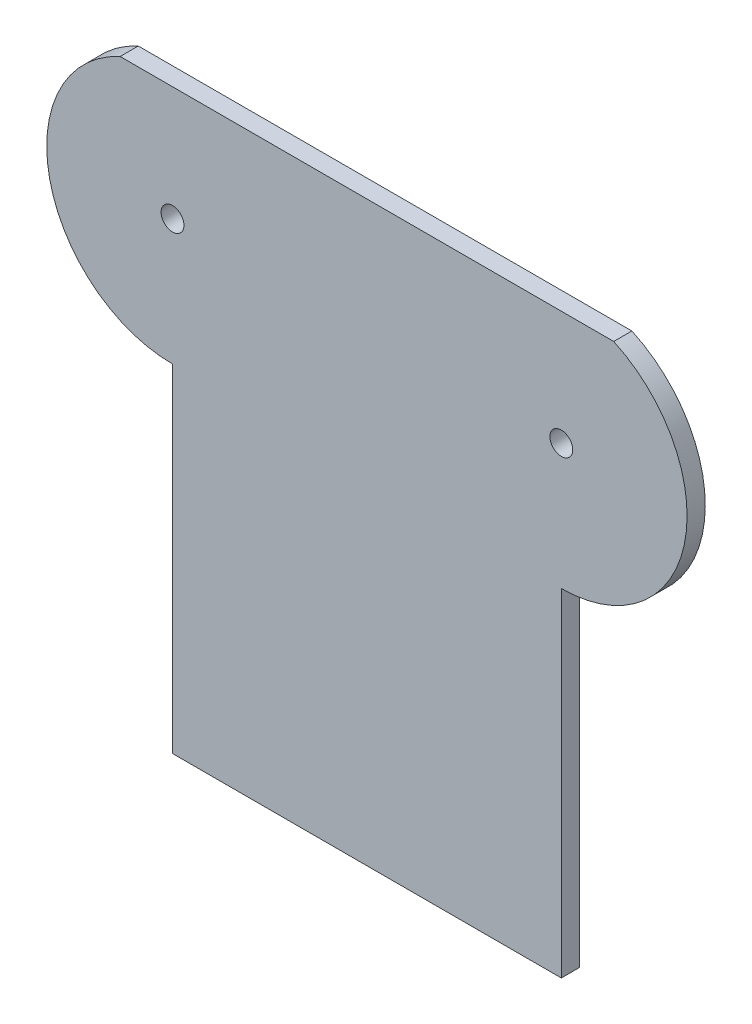
ISO-10303-21;
HEADER;
FILE_DESCRIPTION(('STEP AP214'),'2;1');
FILE_NAME('part.step','',(''),(''),'','','');
FILE_SCHEMA(('AUTOMOTIVE_DESIGN { 1 0 10303 214 1 1 1 1 }'));
ENDSEC;
DATA;
#1=APPLICATION_CONTEXT('core data for automotive mechanical design processes');
#2=APPLICATION_PROTOCOL_DEFINITION('international standard','automotive_design',2000,#1);
#3=PRODUCT_CONTEXT('',#1,'mechanical');
#4=PRODUCT('Part','Part','',(#3));
#5=PRODUCT_RELATED_PRODUCT_CATEGORY('part','',(#4));
#6=PRODUCT_DEFINITION_FORMATION('','',#4);
#7=PRODUCT_DEFINITION_CONTEXT('part definition',#1,'design');
#8=PRODUCT_DEFINITION('design','',#6,#7);
#9=PRODUCT_DEFINITION_SHAPE('','',#8);
#10=(LENGTH_UNIT() NAMED_UNIT(*) SI_UNIT(.MILLI.,.METRE.));
#11=(NAMED_UNIT(*) PLANE_ANGLE_UNIT() SI_UNIT($,.RADIAN.));
#12=(NAMED_UNIT(*) SI_UNIT($,.STERADIAN.) SOLID_ANGLE_UNIT());
#13=UNCERTAINTY_MEASURE_WITH_UNIT(LENGTH_MEASURE(1.E-05),#10,'distance_accuracy_value','');
#14=(GEOMETRIC_REPRESENTATION_CONTEXT(3) GLOBAL_UNCERTAINTY_ASSIGNED_CONTEXT((#13)) GLOBAL_UNIT_ASSIGNED_CONTEXT((#10,
#11,#12)) REPRESENTATION_CONTEXT('',''));
#15=CARTESIAN_POINT('',(0.,0.,0.));
#16=DIRECTION('',(0.,0.,1.));
#17=DIRECTION('',(1.,0.,0.));
#18=AXIS2_PLACEMENT_3D('',#15,#16,#17);
#19=CARTESIAN_POINT('',(56.,50.,3.175));
#20=DIRECTION('',(0.,0.,1.));
#21=DIRECTION('',(1.,0.,0.));
#22=AXIS2_PLACEMENT_3D('',#19,#20,#21);
#23=PLANE('',#22);
#24=CARTESIAN_POINT('',(56.,50.,3.175));
#25=DIRECTION('',(0.,0.,1.));
#26=DIRECTION('',(1.,0.,0.));
#27=AXIS2_PLACEMENT_3D('',#24,#25,#26);
#28=CIRCLE('',#27,2.);
#29=CARTESIAN_POINT('',(58.,50.,3.175));
#30=VERTEX_POINT('',#29);
#31=EDGE_CURVE('E130',#30,#30,#28,.T.);
#32=ORIENTED_EDGE('',*,*,#31,.F.);
#33=EDGE_LOOP('',(#32));
#34=FACE_BOUND('',#33,.T.);
#35=CARTESIAN_POINT('',(56.,50.,3.175));
#36=DIRECTION('',(0.,0.,1.));
#37=DIRECTION('',(1.,0.,0.));
#38=AXIS2_PLACEMENT_3D('',#35,#36,#37);
#39=CIRCLE('',#38,22.);
#40=CARTESIAN_POINT('',(46.8348486100883,70.,3.175));
#41=VERTEX_POINT('',#40);
#42=CARTESIAN_POINT('',(56.,28.,3.175));
#43=VERTEX_POINT('',#42);
#44=EDGE_CURVE('E138',#41,#43,#39,.T.);
#45=ORIENTED_EDGE('',*,*,#44,.T.);
#46=DIRECTION('',(0.,-1.,0.));
#47=VECTOR('',#46,1.);
#48=CARTESIAN_POINT('',(56.,28.,3.175));
#49=LINE('',#48,#47);
#50=CARTESIAN_POINT('',(56.,-31.,3.175));
#51=VERTEX_POINT('',#50);
#52=EDGE_CURVE('E96',#43,#51,#49,.T.);
#53=ORIENTED_EDGE('',*,*,#52,.T.);
#54=DIRECTION('',(1.,0.,0.));
#55=VECTOR('',#54,1.);
#56=CARTESIAN_POINT('',(56.,-31.,3.175));
#57=LINE('',#56,#55);
#58=CARTESIAN_POINT('',(124.,-31.,3.175));
#59=VERTEX_POINT('',#58);
#60=EDGE_CURVE('E109',#51,#59,#57,.T.);
#61=ORIENTED_EDGE('',*,*,#60,.T.);
#62=DIRECTION('',(0.,1.,0.));
#63=VECTOR('',#62,1.);
#64=CARTESIAN_POINT('',(124.,-31.,3.175));
#65=LINE('',#64,#63);
#66=CARTESIAN_POINT('',(124.,27.9999999999999,3.175));
#67=VERTEX_POINT('',#66);
#68=EDGE_CURVE('E103',#59,#67,#65,.T.);
#69=ORIENTED_EDGE('',*,*,#68,.T.);
#70=CARTESIAN_POINT('',(124.,49.9999999999999,3.175));
#71=DIRECTION('',(0.,0.,1.));
#72=DIRECTION('',(-1.,0.,0.));
#73=AXIS2_PLACEMENT_3D('',#70,#71,#72);
#74=CIRCLE('',#73,22.);
#75=CARTESIAN_POINT('',(133.165151389912,70.,3.175));
#76=VERTEX_POINT('',#75);
#77=EDGE_CURVE('E107',#67,#76,#74,.T.);
#78=ORIENTED_EDGE('',*,*,#77,.T.);
#79=DIRECTION('',(-1.,0.,0.));
#80=VECTOR('',#79,1.);
#81=CARTESIAN_POINT('',(46.8348486100883,70.,3.175));
#82=LINE('',#81,#80);
#83=EDGE_CURVE('E59',#76,#41,#82,.T.);
#84=ORIENTED_EDGE('',*,*,#83,.T.);
#85=EDGE_LOOP('',(#45,#53,#61,#69,#78,#84));
#86=FACE_BOUND('',#85,.T.);
#87=CARTESIAN_POINT('',(124.,49.9999999999999,3.175));
#88=DIRECTION('',(0.,0.,1.));
#89=DIRECTION('',(1.,0.,0.));
#90=AXIS2_PLACEMENT_3D('',#87,#88,#89);
#91=CIRCLE('',#90,1.99999999999997);
#92=CARTESIAN_POINT('',(126.,49.9999999999999,3.175));
#93=VERTEX_POINT('',#92);
#94=EDGE_CURVE('E180',#93,#93,#91,.T.);
#95=ORIENTED_EDGE('',*,*,#94,.F.);
#96=EDGE_LOOP('',(#95));
#97=FACE_BOUND('',#96,.T.);
#98=ADVANCED_FACE('F42',(#34,#86,#97),#23,.T.);
#99=CARTESIAN_POINT('',(56.,50.,0.));
#100=DIRECTION('',(0.,0.,1.));
#101=DIRECTION('',(1.,0.,0.));
#102=AXIS2_PLACEMENT_3D('',#99,#100,#101);
#103=PLANE('',#102);
#104=CARTESIAN_POINT('',(56.,50.,0.));
#105=DIRECTION('',(0.,0.,1.));
#106=DIRECTION('',(1.,0.,0.));
#107=AXIS2_PLACEMENT_3D('',#104,#105,#106);
#108=CIRCLE('',#107,22.);
#109=CARTESIAN_POINT('',(46.8348486100883,70.,0.));
#110=VERTEX_POINT('',#109);
#111=CARTESIAN_POINT('',(56.,28.,0.));
#112=VERTEX_POINT('',#111);
#113=EDGE_CURVE('E126',#110,#112,#108,.T.);
#114=ORIENTED_EDGE('',*,*,#113,.F.);
#115=DIRECTION('',(-1.,0.,0.));
#116=VECTOR('',#115,1.);
#117=CARTESIAN_POINT('',(46.8348486100883,70.,0.));
#118=LINE('',#117,#116);
#119=CARTESIAN_POINT('',(133.165151389912,70.,0.));
#120=VERTEX_POINT('',#119);
#121=EDGE_CURVE('E88',#120,#110,#118,.T.);
#122=ORIENTED_EDGE('',*,*,#121,.F.);
#123=CARTESIAN_POINT('',(124.,49.9999999999999,0.));
#124=DIRECTION('',(0.,0.,1.));
#125=DIRECTION('',(-1.,0.,0.));
#126=AXIS2_PLACEMENT_3D('',#123,#124,#125);
#127=CIRCLE('',#126,22.);
#128=CARTESIAN_POINT('',(124.,27.9999999999999,0.));
#129=VERTEX_POINT('',#128);
#130=EDGE_CURVE('E82',#129,#120,#127,.T.);
#131=ORIENTED_EDGE('',*,*,#130,.F.);
#132=DIRECTION('',(0.,1.,0.));
#133=VECTOR('',#132,1.);
#134=CARTESIAN_POINT('',(124.,28.,0.));
#135=LINE('',#134,#133);
#136=CARTESIAN_POINT('',(124.,-31.,0.));
#137=VERTEX_POINT('',#136);
#138=EDGE_CURVE('E116',#137,#129,#135,.T.);
#139=ORIENTED_EDGE('',*,*,#138,.F.);
#140=DIRECTION('',(1.,0.,0.));
#141=VECTOR('',#140,1.);
#142=CARTESIAN_POINT('',(56.,-31.,0.));
#143=LINE('',#142,#141);
#144=CARTESIAN_POINT('',(56.,-31.,0.));
#145=VERTEX_POINT('',#144);
#146=EDGE_CURVE('E132',#145,#137,#143,.T.);
#147=ORIENTED_EDGE('',*,*,#146,.F.);
#148=DIRECTION('',(0.,-1.,0.));
#149=VECTOR('',#148,1.);
#150=CARTESIAN_POINT('',(56.,0.,0.));
#151=LINE('',#150,#149);
#152=EDGE_CURVE('E129',#112,#145,#151,.T.);
#153=ORIENTED_EDGE('',*,*,#152,.F.);
#154=EDGE_LOOP('',(#114,#122,#131,#139,#147,#153));
#155=FACE_BOUND('',#154,.T.);
#156=CARTESIAN_POINT('',(56.,50.,0.));
#157=DIRECTION('',(0.,0.,1.));
#158=DIRECTION('',(1.,0.,0.));
#159=AXIS2_PLACEMENT_3D('',#156,#157,#158);
#160=CIRCLE('',#159,2.);
#161=CARTESIAN_POINT('',(58.,50.,0.));
#162=VERTEX_POINT('',#161);
#163=EDGE_CURVE('E186',#162,#162,#160,.T.);
#164=ORIENTED_EDGE('',*,*,#163,.T.);
#165=EDGE_LOOP('',(#164));
#166=FACE_BOUND('',#165,.T.);
#167=CARTESIAN_POINT('',(124.,49.9999999999999,0.));
#168=DIRECTION('',(0.,0.,1.));
#169=DIRECTION('',(1.,0.,0.));
#170=AXIS2_PLACEMENT_3D('',#167,#168,#169);
#171=CIRCLE('',#170,1.99999999999997);
#172=CARTESIAN_POINT('',(126.,49.9999999999999,0.));
#173=VERTEX_POINT('',#172);
#174=EDGE_CURVE('E183',#173,#173,#171,.T.);
#175=ORIENTED_EDGE('',*,*,#174,.T.);
#176=EDGE_LOOP('',(#175));
#177=FACE_BOUND('',#176,.T.);
#178=ADVANCED_FACE('F147',(#155,#166,#177),#103,.F.);
#179=CARTESIAN_POINT('',(56.,50.,3.175));
#180=DIRECTION('',(0.,0.,-1.));
#181=DIRECTION('',(-1.,0.,0.));
#182=AXIS2_PLACEMENT_3D('',#179,#180,#181);
#183=CYLINDRICAL_SURFACE('',#182,22.);
#184=ORIENTED_EDGE('',*,*,#113,.T.);
#185=DIRECTION('',(0.,0.,-1.));
#186=VECTOR('',#185,1.);
#187=CARTESIAN_POINT('',(56.,28.,3.175));
#188=LINE('',#187,#186);
#189=EDGE_CURVE('E11',#43,#112,#188,.T.);
#190=ORIENTED_EDGE('',*,*,#189,.F.);
#191=ORIENTED_EDGE('',*,*,#44,.F.);
#192=DIRECTION('',(0.,0.,-1.));
#193=VECTOR('',#192,1.);
#194=CARTESIAN_POINT('',(46.8348486100883,70.,3.175));
#195=LINE('',#194,#193);
#196=EDGE_CURVE('E122',#41,#110,#195,.T.);
#197=ORIENTED_EDGE('',*,*,#196,.T.);
#198=EDGE_LOOP('',(#184,#190,#191,#197));
#199=FACE_BOUND('',#198,.T.);
#200=ADVANCED_FACE('F44',(#199),#183,.T.);
#201=CARTESIAN_POINT('',(56.,0.,3.175));
#202=DIRECTION('',(1.,0.,0.));
#203=DIRECTION('',(0.,1.,0.));
#204=AXIS2_PLACEMENT_3D('',#201,#202,#203);
#205=PLANE('',#204);
#206=ORIENTED_EDGE('',*,*,#152,.T.);
#207=DIRECTION('',(0.,0.,-1.));
#208=VECTOR('',#207,1.);
#209=CARTESIAN_POINT('',(56.,-31.,3.175));
#210=LINE('',#209,#208);
#211=EDGE_CURVE('E51',#51,#145,#210,.T.);
#212=ORIENTED_EDGE('',*,*,#211,.F.);
#213=ORIENTED_EDGE('',*,*,#52,.F.);
#214=ORIENTED_EDGE('',*,*,#189,.T.);
#215=EDGE_LOOP('',(#206,#212,#213,#214));
#216=FACE_BOUND('',#215,.T.);
#217=ADVANCED_FACE('F229',(#216),#205,.F.);
#218=CARTESIAN_POINT('',(56.,-31.,3.175));
#219=DIRECTION('',(0.,1.,0.));
#220=DIRECTION('',(-1.,0.,0.));
#221=AXIS2_PLACEMENT_3D('',#218,#219,#220);
#222=PLANE('',#221);
#223=ORIENTED_EDGE('',*,*,#146,.T.);
#224=DIRECTION('',(0.,0.,-1.));
#225=VECTOR('',#224,1.);
#226=CARTESIAN_POINT('',(124.,-31.,3.175));
#227=LINE('',#226,#225);
#228=EDGE_CURVE('E117',#59,#137,#227,.T.);
#229=ORIENTED_EDGE('',*,*,#228,.F.);
#230=ORIENTED_EDGE('',*,*,#60,.F.);
#231=ORIENTED_EDGE('',*,*,#211,.T.);
#232=EDGE_LOOP('',(#223,#229,#230,#231));
#233=FACE_BOUND('',#232,.T.);
#234=ADVANCED_FACE('F144',(#233),#222,.F.);
#235=CARTESIAN_POINT('',(124.,28.,3.175));
#236=DIRECTION('',(-1.,0.,0.));
#237=DIRECTION('',(0.,0.,1.));
#238=AXIS2_PLACEMENT_3D('',#235,#236,#237);
#239=PLANE('',#238);
#240=ORIENTED_EDGE('',*,*,#138,.T.);
#241=DIRECTION('',(0.,0.,-1.));
#242=VECTOR('',#241,1.);
#243=CARTESIAN_POINT('',(124.,27.9999999999999,3.175));
#244=LINE('',#243,#242);
#245=EDGE_CURVE('E114',#67,#129,#244,.T.);
#246=ORIENTED_EDGE('',*,*,#245,.F.);
#247=ORIENTED_EDGE('',*,*,#68,.F.);
#248=ORIENTED_EDGE('',*,*,#228,.T.);
#249=EDGE_LOOP('',(#240,#246,#247,#248));
#250=FACE_BOUND('',#249,.T.);
#251=ADVANCED_FACE('F115',(#250),#239,.F.);
#252=CARTESIAN_POINT('',(124.,49.9999999999999,3.175));
#253=DIRECTION('',(0.,0.,-1.));
#254=DIRECTION('',(-1.,0.,0.));
#255=AXIS2_PLACEMENT_3D('',#252,#253,#254);
#256=CYLINDRICAL_SURFACE('',#255,22.);
#257=ORIENTED_EDGE('',*,*,#130,.T.);
#258=DIRECTION('',(0.,0.,-1.));
#259=VECTOR('',#258,1.);
#260=CARTESIAN_POINT('',(133.165151389912,70.,3.175));
#261=LINE('',#260,#259);
#262=EDGE_CURVE('E118',#76,#120,#261,.T.);
#263=ORIENTED_EDGE('',*,*,#262,.F.);
#264=ORIENTED_EDGE('',*,*,#77,.F.);
#265=ORIENTED_EDGE('',*,*,#245,.T.);
#266=EDGE_LOOP('',(#257,#263,#264,#265));
#267=FACE_BOUND('',#266,.T.);
#268=ADVANCED_FACE('F120',(#267),#256,.T.);
#269=CARTESIAN_POINT('',(46.8348486100883,70.,3.175));
#270=DIRECTION('',(0.,-1.,0.));
#271=DIRECTION('',(1.,0.,0.));
#272=AXIS2_PLACEMENT_3D('',#269,#270,#271);
#273=PLANE('',#272);
#274=ORIENTED_EDGE('',*,*,#121,.T.);
#275=ORIENTED_EDGE('',*,*,#196,.F.);
#276=ORIENTED_EDGE('',*,*,#83,.F.);
#277=ORIENTED_EDGE('',*,*,#262,.T.);
#278=EDGE_LOOP('',(#274,#275,#276,#277));
#279=FACE_BOUND('',#278,.T.);
#280=ADVANCED_FACE('F152',(#279),#273,.F.);
#281=CARTESIAN_POINT('',(56.,50.,3.175));
#282=DIRECTION('',(0.,0.,-1.));
#283=DIRECTION('',(-1.,0.,0.));
#284=AXIS2_PLACEMENT_3D('',#281,#282,#283);
#285=CYLINDRICAL_SURFACE('',#284,2.);
#286=ORIENTED_EDGE('',*,*,#31,.T.);
#287=EDGE_LOOP('',(#286));
#288=FACE_BOUND('',#287,.T.);
#289=ORIENTED_EDGE('',*,*,#163,.F.);
#290=EDGE_LOOP('',(#289));
#291=FACE_BOUND('',#290,.T.);
#292=ADVANCED_FACE('F154',(#288,#291),#285,.F.);
#293=CARTESIAN_POINT('',(124.,49.9999999999999,3.175));
#294=DIRECTION('',(0.,0.,-1.));
#295=DIRECTION('',(-1.,0.,0.));
#296=AXIS2_PLACEMENT_3D('',#293,#294,#295);
#297=CYLINDRICAL_SURFACE('',#296,1.99999999999997);
#298=ORIENTED_EDGE('',*,*,#94,.T.);
#299=EDGE_LOOP('',(#298));
#300=FACE_BOUND('',#299,.T.);
#301=ORIENTED_EDGE('',*,*,#174,.F.);
#302=EDGE_LOOP('',(#301));
#303=FACE_BOUND('',#302,.T.);
#304=ADVANCED_FACE('F160',(#300,#303),#297,.F.);
#305=CLOSED_SHELL('',(#98,#178,#200,#217,#234,#251,#268,#280,#292,#304));
#306=MANIFOLD_SOLID_BREP('B2',#305);
#307=ADVANCED_BREP_SHAPE_REPRESENTATION('',(#18,#306),#14);
#308=SHAPE_DEFINITION_REPRESENTATION(#9,#307);
ENDSEC;
END-ISO-10303-21;
